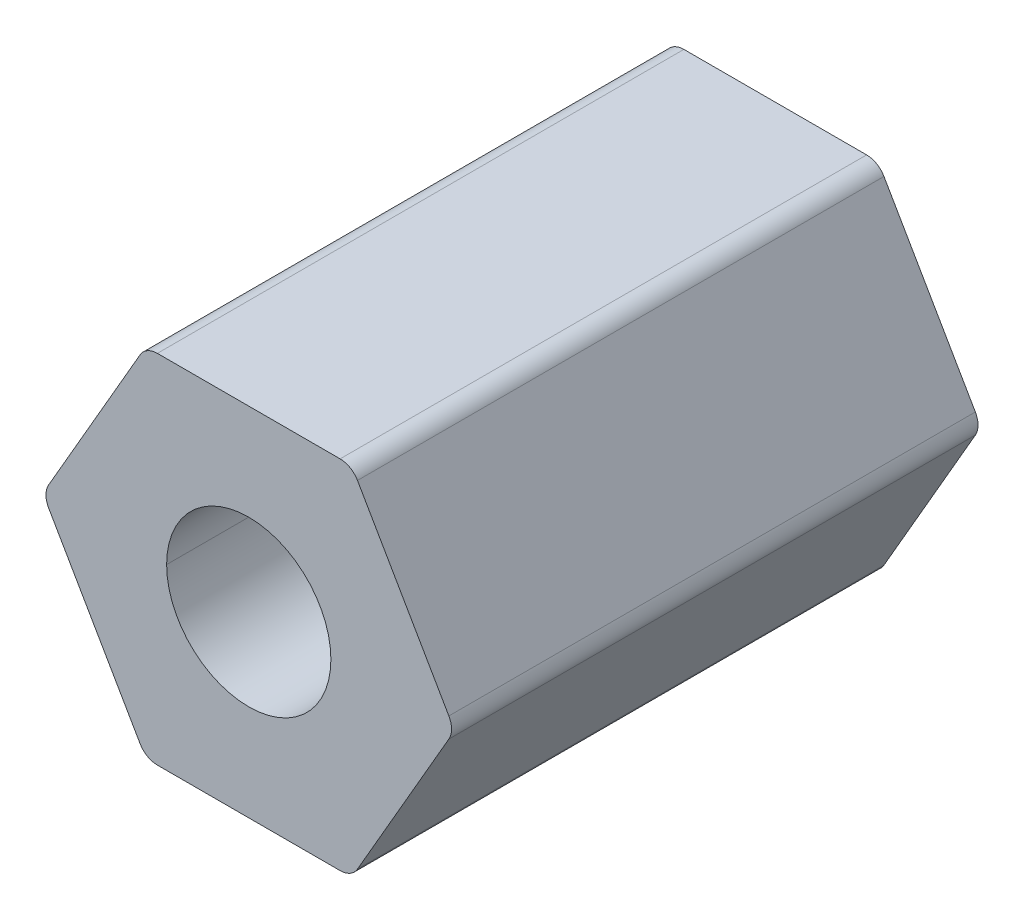
ISO-10303-21;
HEADER;
FILE_DESCRIPTION(('STEP AP214'),'2;1');
FILE_NAME('part.step','',(''),(''),'','','');
FILE_SCHEMA(('AUTOMOTIVE_DESIGN { 1 0 10303 214 1 1 1 1 }'));
ENDSEC;
DATA;
#1=APPLICATION_CONTEXT('core data for automotive mechanical design processes');
#2=APPLICATION_PROTOCOL_DEFINITION('international standard','automotive_design',2000,#1);
#3=PRODUCT_CONTEXT('',#1,'mechanical');
#4=PRODUCT('Part','Part','',(#3));
#5=PRODUCT_RELATED_PRODUCT_CATEGORY('part','',(#4));
#6=PRODUCT_DEFINITION_FORMATION('','',#4);
#7=PRODUCT_DEFINITION_CONTEXT('part definition',#1,'design');
#8=PRODUCT_DEFINITION('design','',#6,#7);
#9=PRODUCT_DEFINITION_SHAPE('','',#8);
#10=(LENGTH_UNIT() NAMED_UNIT(*) SI_UNIT(.MILLI.,.METRE.));
#11=(NAMED_UNIT(*) PLANE_ANGLE_UNIT() SI_UNIT($,.RADIAN.));
#12=(NAMED_UNIT(*) SI_UNIT($,.STERADIAN.) SOLID_ANGLE_UNIT());
#13=UNCERTAINTY_MEASURE_WITH_UNIT(LENGTH_MEASURE(1.E-05),#10,'distance_accuracy_value','');
#14=(GEOMETRIC_REPRESENTATION_CONTEXT(3) GLOBAL_UNCERTAINTY_ASSIGNED_CONTEXT((#13)) GLOBAL_UNIT_ASSIGNED_CONTEXT((#10,
#11,#12)) REPRESENTATION_CONTEXT('',''));
#15=CARTESIAN_POINT('',(0.,0.,0.));
#16=DIRECTION('',(0.,0.,1.));
#17=DIRECTION('',(1.,0.,0.));
#18=AXIS2_PLACEMENT_3D('',#15,#16,#17);
#19=CARTESIAN_POINT('',(0.,0.,-4.471676241228));
#20=DIRECTION('',(0.,0.,1.));
#21=DIRECTION('',(-1.,0.,0.));
#22=AXIS2_PLACEMENT_3D('',#19,#20,#21);
#23=CYLINDRICAL_SURFACE('',#22,1.025);
#24=DIRECTION('',(0.,0.,1.));
#25=VECTOR('',#24,1.);
#26=CARTESIAN_POINT('',(1.025,0.,0.));
#27=LINE('',#26,#25);
#28=CARTESIAN_POINT('',(1.025,0.,0.));
#29=VERTEX_POINT('',#28);
#30=CARTESIAN_POINT('',(1.025,0.,6.57));
#31=VERTEX_POINT('',#30);
#32=EDGE_CURVE('P0_E11',#29,#31,#27,.T.);
#33=ORIENTED_EDGE('',*,*,#32,.T.);
#34=CARTESIAN_POINT('',(0.,0.,6.57));
#35=DIRECTION('',(0.,0.,1.));
#36=DIRECTION('',(1.,0.,0.));
#37=AXIS2_PLACEMENT_3D('',#34,#35,#36);
#38=CIRCLE('',#37,1.025);
#39=CARTESIAN_POINT('',(-1.025,0.,6.57));
#40=VERTEX_POINT('',#39);
#41=EDGE_CURVE('P0_E184',#31,#40,#38,.T.);
#42=ORIENTED_EDGE('',*,*,#41,.T.);
#43=DIRECTION('',(0.,0.,1.));
#44=VECTOR('',#43,1.);
#45=CARTESIAN_POINT('',(-1.025,0.,0.));
#46=LINE('',#45,#44);
#47=CARTESIAN_POINT('',(-1.025,0.,0.));
#48=VERTEX_POINT('',#47);
#49=EDGE_CURVE('P0_E27',#48,#40,#46,.T.);
#50=ORIENTED_EDGE('',*,*,#49,.F.);
#51=CARTESIAN_POINT('',(0.,0.,0.));
#52=DIRECTION('',(0.,0.,1.));
#53=DIRECTION('',(1.,0.,0.));
#54=AXIS2_PLACEMENT_3D('',#51,#52,#53);
#55=CIRCLE('',#54,1.025);
#56=EDGE_CURVE('P0_E254',#29,#48,#55,.T.);
#57=ORIENTED_EDGE('',*,*,#56,.F.);
#58=EDGE_LOOP('',(#33,#42,#50,#57));
#59=FACE_BOUND('',#58,.T.);
#60=ADVANCED_FACE('P0_F17',(#59),#23,.F.);
#61=CARTESIAN_POINT('',(0.,0.,-4.471676241228));
#62=DIRECTION('',(0.,0.,1.));
#63=DIRECTION('',(-1.,0.,0.));
#64=AXIS2_PLACEMENT_3D('',#61,#62,#63);
#65=CYLINDRICAL_SURFACE('',#64,1.025);
#66=ORIENTED_EDGE('',*,*,#49,.T.);
#67=CARTESIAN_POINT('',(0.,0.,6.57));
#68=DIRECTION('',(0.,0.,1.));
#69=DIRECTION('',(-1.,0.,0.));
#70=AXIS2_PLACEMENT_3D('',#67,#68,#69);
#71=CIRCLE('',#70,1.025);
#72=EDGE_CURVE('P0_E244',#40,#31,#71,.T.);
#73=ORIENTED_EDGE('',*,*,#72,.T.);
#74=ORIENTED_EDGE('',*,*,#32,.F.);
#75=CARTESIAN_POINT('',(0.,0.,0.));
#76=DIRECTION('',(0.,0.,1.));
#77=DIRECTION('',(-1.,0.,0.));
#78=AXIS2_PLACEMENT_3D('',#75,#76,#77);
#79=CIRCLE('',#78,1.025);
#80=EDGE_CURVE('P0_E251',#48,#29,#79,.T.);
#81=ORIENTED_EDGE('',*,*,#80,.F.);
#82=EDGE_LOOP('',(#66,#73,#74,#81));
#83=FACE_BOUND('',#82,.T.);
#84=ADVANCED_FACE('P0_F317',(#83),#65,.F.);
#85=CARTESIAN_POINT('',(0.,0.,6.57));
#86=DIRECTION('',(0.,0.,1.));
#87=DIRECTION('',(1.,0.,0.));
#88=AXIS2_PLACEMENT_3D('',#85,#86,#87);
#89=PLANE('',#88);
#90=ORIENTED_EDGE('',*,*,#41,.F.);
#91=ORIENTED_EDGE('',*,*,#72,.F.);
#92=EDGE_LOOP('',(#90,#91));
#93=FACE_BOUND('',#92,.T.);
#94=DIRECTION('',(0.500000000000017,0.866025403784429,0.));
#95=VECTOR('',#94,1.);
#96=CARTESIAN_POINT('',(1.356773132596,-2.1,6.57));
#97=LINE('',#96,#95);
#98=CARTESIAN_POINT('',(1.356773132596,-2.1,6.57));
#99=VERTEX_POINT('',#98);
#100=CARTESIAN_POINT('',(2.497039914245,-0.125,6.57));
#101=VERTEX_POINT('',#100);
#102=EDGE_CURVE('P0_E182',#99,#101,#97,.T.);
#103=ORIENTED_EDGE('',*,*,#102,.T.);
#104=CARTESIAN_POINT('',(2.280533563299,0.,6.57));
#105=DIRECTION('',(0.,0.,1.));
#106=DIRECTION('',(0.866025403784429,-0.500000000000017,0.));
#107=AXIS2_PLACEMENT_3D('',#104,#105,#106);
#108=CIRCLE('',#107,0.25);
#109=CARTESIAN_POINT('',(2.497039914245,0.125,6.57));
#110=VERTEX_POINT('',#109);
#111=EDGE_CURVE('P0_E245',#101,#110,#108,.T.);
#112=ORIENTED_EDGE('',*,*,#111,.T.);
#113=DIRECTION('',(-0.500000000000017,0.866025403784429,0.));
#114=VECTOR('',#113,1.);
#115=CARTESIAN_POINT('',(2.497039914245,0.125,6.57));
#116=LINE('',#115,#114);
#117=CARTESIAN_POINT('',(1.356773132596,2.1,6.57));
#118=VERTEX_POINT('',#117);
#119=EDGE_CURVE('P0_E216',#110,#118,#116,.T.);
#120=ORIENTED_EDGE('',*,*,#119,.T.);
#121=CARTESIAN_POINT('',(1.14026678165,1.975,6.57));
#122=DIRECTION('',(0.,0.,1.));
#123=DIRECTION('',(0.866025403784429,0.500000000000017,0.));
#124=AXIS2_PLACEMENT_3D('',#121,#122,#123);
#125=CIRCLE('',#124,0.25);
#126=CARTESIAN_POINT('',(1.14026678165,2.225,6.57));
#127=VERTEX_POINT('',#126);
#128=EDGE_CURVE('P0_E201',#118,#127,#125,.T.);
#129=ORIENTED_EDGE('',*,*,#128,.T.);
#130=DIRECTION('',(-1.,0.,0.));
#131=VECTOR('',#130,1.);
#132=CARTESIAN_POINT('',(1.14026678165,2.225,6.57));
#133=LINE('',#132,#131);
#134=CARTESIAN_POINT('',(-1.14026678165,2.225,6.57));
#135=VERTEX_POINT('',#134);
#136=EDGE_CURVE('P0_E202',#127,#135,#133,.T.);
#137=ORIENTED_EDGE('',*,*,#136,.T.);
#138=CARTESIAN_POINT('',(-1.14026678165,1.975,6.57));
#139=DIRECTION('',(0.,0.,1.));
#140=DIRECTION('',(0.,1.,0.));
#141=AXIS2_PLACEMENT_3D('',#138,#139,#140);
#142=CIRCLE('',#141,0.25);
#143=CARTESIAN_POINT('',(-1.356773132596,2.1,6.57));
#144=VERTEX_POINT('',#143);
#145=EDGE_CURVE('P0_E224',#135,#144,#142,.T.);
#146=ORIENTED_EDGE('',*,*,#145,.T.);
#147=DIRECTION('',(-0.500000000000017,-0.866025403784429,0.));
#148=VECTOR('',#147,1.);
#149=CARTESIAN_POINT('',(-1.356773132596,2.1,6.57));
#150=LINE('',#149,#148);
#151=CARTESIAN_POINT('',(-2.497039914245,0.125,6.57));
#152=VERTEX_POINT('',#151);
#153=EDGE_CURVE('P0_E198',#144,#152,#150,.T.);
#154=ORIENTED_EDGE('',*,*,#153,.T.);
#155=CARTESIAN_POINT('',(-2.280533563299,0.,6.57));
#156=DIRECTION('',(0.,0.,1.));
#157=DIRECTION('',(-0.866025403784429,0.500000000000017,0.));
#158=AXIS2_PLACEMENT_3D('',#155,#156,#157);
#159=CIRCLE('',#158,0.25);
#160=CARTESIAN_POINT('',(-2.497039914245,-0.125,6.57));
#161=VERTEX_POINT('',#160);
#162=EDGE_CURVE('P0_E188',#152,#161,#159,.T.);
#163=ORIENTED_EDGE('',*,*,#162,.T.);
#164=DIRECTION('',(0.500000000000017,-0.866025403784429,0.));
#165=VECTOR('',#164,1.);
#166=CARTESIAN_POINT('',(-2.497039914245,-0.125,6.57));
#167=LINE('',#166,#165);
#168=CARTESIAN_POINT('',(-1.356773132596,-2.1,6.57));
#169=VERTEX_POINT('',#168);
#170=EDGE_CURVE('P0_E123',#161,#169,#167,.T.);
#171=ORIENTED_EDGE('',*,*,#170,.T.);
#172=CARTESIAN_POINT('',(-1.14026678165,-1.975,6.57));
#173=DIRECTION('',(0.,0.,1.));
#174=DIRECTION('',(-0.866025403784429,-0.500000000000017,0.));
#175=AXIS2_PLACEMENT_3D('',#172,#173,#174);
#176=CIRCLE('',#175,0.25);
#177=CARTESIAN_POINT('',(-1.14026678165,-2.225,6.57));
#178=VERTEX_POINT('',#177);
#179=EDGE_CURVE('P0_E131',#169,#178,#176,.T.);
#180=ORIENTED_EDGE('',*,*,#179,.T.);
#181=DIRECTION('',(1.,0.,0.));
#182=VECTOR('',#181,1.);
#183=CARTESIAN_POINT('',(-1.14026678165,-2.225,6.57));
#184=LINE('',#183,#182);
#185=CARTESIAN_POINT('',(1.14026678165,-2.225,6.57));
#186=VERTEX_POINT('',#185);
#187=EDGE_CURVE('P0_E210',#178,#186,#184,.T.);
#188=ORIENTED_EDGE('',*,*,#187,.T.);
#189=CARTESIAN_POINT('',(1.14026678165,-1.975,6.57));
#190=DIRECTION('',(0.,0.,1.));
#191=DIRECTION('',(0.,-1.,0.));
#192=AXIS2_PLACEMENT_3D('',#189,#190,#191);
#193=CIRCLE('',#192,0.25);
#194=EDGE_CURVE('P0_E204',#186,#99,#193,.T.);
#195=ORIENTED_EDGE('',*,*,#194,.T.);
#196=EDGE_LOOP('',(#103,#112,#120,#129,#137,#146,#154,#163,#171,#180,#188,#195));
#197=FACE_BOUND('',#196,.T.);
#198=ADVANCED_FACE('P0_F293',(#93,#197),#89,.T.);
#199=CARTESIAN_POINT('',(1.284604348947,-2.225,0.));
#200=DIRECTION('',(0.866025403784429,-0.500000000000017,0.));
#201=DIRECTION('',(0.,0.,-1.));
#202=AXIS2_PLACEMENT_3D('',#199,#200,#201);
#203=PLANE('',#202);
#204=DIRECTION('',(0.500000000000017,0.866025403784429,0.));
#205=VECTOR('',#204,1.);
#206=CARTESIAN_POINT('',(1.356773132596,-2.1,0.));
#207=LINE('',#206,#205);
#208=CARTESIAN_POINT('',(1.356773132596,-2.1,0.));
#209=VERTEX_POINT('',#208);
#210=CARTESIAN_POINT('',(2.497039914245,-0.125,0.));
#211=VERTEX_POINT('',#210);
#212=EDGE_CURVE('P0_E237',#209,#211,#207,.T.);
#213=ORIENTED_EDGE('',*,*,#212,.T.);
#214=DIRECTION('',(0.,0.,-1.));
#215=VECTOR('',#214,1.);
#216=CARTESIAN_POINT('',(2.497039914245,-0.125,6.57));
#217=LINE('',#216,#215);
#218=EDGE_CURVE('P0_E185',#101,#211,#217,.T.);
#219=ORIENTED_EDGE('',*,*,#218,.F.);
#220=ORIENTED_EDGE('',*,*,#102,.F.);
#221=DIRECTION('',(0.,0.,-1.));
#222=VECTOR('',#221,1.);
#223=CARTESIAN_POINT('',(1.356773132596,-2.1,6.57));
#224=LINE('',#223,#222);
#225=EDGE_CURVE('P0_E209',#99,#209,#224,.T.);
#226=ORIENTED_EDGE('',*,*,#225,.T.);
#227=EDGE_LOOP('',(#213,#219,#220,#226));
#228=FACE_BOUND('',#227,.T.);
#229=ADVANCED_FACE('P0_F354',(#228),#203,.T.);
#230=CARTESIAN_POINT('',(2.280533563299,0.,15.134652));
#231=DIRECTION('',(0.,0.,-1.));
#232=DIRECTION('',(0.866025403784429,0.500000000000017,0.));
#233=AXIS2_PLACEMENT_3D('',#230,#231,#232);
#234=CYLINDRICAL_SURFACE('',#233,0.25);
#235=DIRECTION('',(0.,0.,-1.));
#236=VECTOR('',#235,1.);
#237=CARTESIAN_POINT('',(2.497039914245,0.125,6.57));
#238=LINE('',#237,#236);
#239=CARTESIAN_POINT('',(2.497039914245,0.125,0.));
#240=VERTEX_POINT('',#239);
#241=EDGE_CURVE('P0_E219',#110,#240,#238,.T.);
#242=ORIENTED_EDGE('',*,*,#241,.F.);
#243=ORIENTED_EDGE('',*,*,#111,.F.);
#244=ORIENTED_EDGE('',*,*,#218,.T.);
#245=CARTESIAN_POINT('',(2.280533563299,0.,0.));
#246=DIRECTION('',(0.,0.,-1.));
#247=DIRECTION('',(0.866025403784429,0.500000000000017,0.));
#248=AXIS2_PLACEMENT_3D('',#245,#246,#247);
#249=CIRCLE('',#248,0.25);
#250=EDGE_CURVE('P0_E233',#240,#211,#249,.T.);
#251=ORIENTED_EDGE('',*,*,#250,.F.);
#252=EDGE_LOOP('',(#242,#243,#244,#251));
#253=FACE_BOUND('',#252,.T.);
#254=ADVANCED_FACE('P0_F351',(#253),#234,.T.);
#255=CARTESIAN_POINT('',(2.569208697894,0.,0.));
#256=DIRECTION('',(0.866025403784429,0.500000000000017,0.));
#257=DIRECTION('',(0.,0.,-1.));
#258=AXIS2_PLACEMENT_3D('',#255,#256,#257);
#259=PLANE('',#258);
#260=DIRECTION('',(-0.500000000000017,0.866025403784429,0.));
#261=VECTOR('',#260,1.);
#262=CARTESIAN_POINT('',(2.497039914245,0.125,0.));
#263=LINE('',#262,#261);
#264=CARTESIAN_POINT('',(1.356773132596,2.1,0.));
#265=VERTEX_POINT('',#264);
#266=EDGE_CURVE('P0_E229',#240,#265,#263,.T.);
#267=ORIENTED_EDGE('',*,*,#266,.T.);
#268=DIRECTION('',(0.,0.,-1.));
#269=VECTOR('',#268,1.);
#270=CARTESIAN_POINT('',(1.356773132596,2.1,6.57));
#271=LINE('',#270,#269);
#272=EDGE_CURVE('P0_E220',#118,#265,#271,.T.);
#273=ORIENTED_EDGE('',*,*,#272,.F.);
#274=ORIENTED_EDGE('',*,*,#119,.F.);
#275=ORIENTED_EDGE('',*,*,#241,.T.);
#276=EDGE_LOOP('',(#267,#273,#274,#275));
#277=FACE_BOUND('',#276,.T.);
#278=ADVANCED_FACE('P0_F19',(#277),#259,.T.);
#279=CARTESIAN_POINT('',(1.14026678165,1.975,15.134652));
#280=DIRECTION('',(0.,0.,-1.));
#281=DIRECTION('',(0.,1.,0.));
#282=AXIS2_PLACEMENT_3D('',#279,#280,#281);
#283=CYLINDRICAL_SURFACE('',#282,0.25);
#284=DIRECTION('',(0.,0.,-1.));
#285=VECTOR('',#284,1.);
#286=CARTESIAN_POINT('',(1.14026678165,2.225,6.57));
#287=LINE('',#286,#285);
#288=CARTESIAN_POINT('',(1.14026678165,2.225,0.));
#289=VERTEX_POINT('',#288);
#290=EDGE_CURVE('P0_E199',#127,#289,#287,.T.);
#291=ORIENTED_EDGE('',*,*,#290,.F.);
#292=ORIENTED_EDGE('',*,*,#128,.F.);
#293=ORIENTED_EDGE('',*,*,#272,.T.);
#294=CARTESIAN_POINT('',(1.14026678165,1.975,0.));
#295=DIRECTION('',(0.,0.,-1.));
#296=DIRECTION('',(0.,1.,0.));
#297=AXIS2_PLACEMENT_3D('',#294,#295,#296);
#298=CIRCLE('',#297,0.25);
#299=EDGE_CURVE('P0_E225',#289,#265,#298,.T.);
#300=ORIENTED_EDGE('',*,*,#299,.F.);
#301=EDGE_LOOP('',(#291,#292,#293,#300));
#302=FACE_BOUND('',#301,.T.);
#303=ADVANCED_FACE('P0_F339',(#302),#283,.T.);
#304=CARTESIAN_POINT('',(1.284604348947,2.225,0.));
#305=DIRECTION('',(0.,1.,0.));
#306=DIRECTION('',(1.,0.,0.));
#307=AXIS2_PLACEMENT_3D('',#304,#305,#306);
#308=PLANE('',#307);
#309=DIRECTION('',(-1.,0.,0.));
#310=VECTOR('',#309,1.);
#311=CARTESIAN_POINT('',(1.14026678165,2.225,0.));
#312=LINE('',#311,#310);
#313=CARTESIAN_POINT('',(-1.14026678165,2.225,0.));
#314=VERTEX_POINT('',#313);
#315=EDGE_CURVE('P0_E230',#289,#314,#312,.T.);
#316=ORIENTED_EDGE('',*,*,#315,.T.);
#317=DIRECTION('',(0.,0.,-1.));
#318=VECTOR('',#317,1.);
#319=CARTESIAN_POINT('',(-1.14026678165,2.225,6.57));
#320=LINE('',#319,#318);
#321=EDGE_CURVE('P0_E221',#135,#314,#320,.T.);
#322=ORIENTED_EDGE('',*,*,#321,.F.);
#323=ORIENTED_EDGE('',*,*,#136,.F.);
#324=ORIENTED_EDGE('',*,*,#290,.T.);
#325=EDGE_LOOP('',(#316,#322,#323,#324));
#326=FACE_BOUND('',#325,.T.);
#327=ADVANCED_FACE('P0_F301',(#326),#308,.T.);
#328=CARTESIAN_POINT('',(-1.14026678165,1.975,15.134652));
#329=DIRECTION('',(0.,0.,-1.));
#330=DIRECTION('',(-0.866025403784429,0.500000000000017,0.));
#331=AXIS2_PLACEMENT_3D('',#328,#329,#330);
#332=CYLINDRICAL_SURFACE('',#331,0.25);
#333=DIRECTION('',(0.,0.,-1.));
#334=VECTOR('',#333,1.);
#335=CARTESIAN_POINT('',(-1.356773132596,2.1,6.57));
#336=LINE('',#335,#334);
#337=CARTESIAN_POINT('',(-1.356773132596,2.1,0.));
#338=VERTEX_POINT('',#337);
#339=EDGE_CURVE('P0_E21',#144,#338,#336,.T.);
#340=ORIENTED_EDGE('',*,*,#339,.F.);
#341=ORIENTED_EDGE('',*,*,#145,.F.);
#342=ORIENTED_EDGE('',*,*,#321,.T.);
#343=CARTESIAN_POINT('',(-1.14026678165,1.975,0.));
#344=DIRECTION('',(0.,0.,-1.));
#345=DIRECTION('',(-0.866025403784429,0.500000000000017,0.));
#346=AXIS2_PLACEMENT_3D('',#343,#344,#345);
#347=CIRCLE('',#346,0.25);
#348=EDGE_CURVE('P0_E193',#338,#314,#347,.T.);
#349=ORIENTED_EDGE('',*,*,#348,.F.);
#350=EDGE_LOOP('',(#340,#341,#342,#349));
#351=FACE_BOUND('',#350,.T.);
#352=ADVANCED_FACE('P0_F305',(#351),#332,.T.);
#353=CARTESIAN_POINT('',(-1.284604348947,2.225,0.));
#354=DIRECTION('',(-0.866025403784429,0.500000000000017,0.));
#355=DIRECTION('',(0.,0.,1.));
#356=AXIS2_PLACEMENT_3D('',#353,#354,#355);
#357=PLANE('',#356);
#358=DIRECTION('',(-0.500000000000017,-0.866025403784429,0.));
#359=VECTOR('',#358,1.);
#360=CARTESIAN_POINT('',(-1.356773132596,2.1,0.));
#361=LINE('',#360,#359);
#362=CARTESIAN_POINT('',(-2.497039914245,0.125,0.));
#363=VERTEX_POINT('',#362);
#364=EDGE_CURVE('P0_E189',#338,#363,#361,.T.);
#365=ORIENTED_EDGE('',*,*,#364,.T.);
#366=DIRECTION('',(0.,0.,-1.));
#367=VECTOR('',#366,1.);
#368=CARTESIAN_POINT('',(-2.497039914245,0.125,6.57));
#369=LINE('',#368,#367);
#370=EDGE_CURVE('P0_E194',#152,#363,#369,.T.);
#371=ORIENTED_EDGE('',*,*,#370,.F.);
#372=ORIENTED_EDGE('',*,*,#153,.F.);
#373=ORIENTED_EDGE('',*,*,#339,.T.);
#374=EDGE_LOOP('',(#365,#371,#372,#373));
#375=FACE_BOUND('',#374,.T.);
#376=ADVANCED_FACE('P0_F344',(#375),#357,.T.);
#377=CARTESIAN_POINT('',(-2.280533563299,0.,15.134652));
#378=DIRECTION('',(0.,0.,-1.));
#379=DIRECTION('',(-0.866025403784429,-0.500000000000017,0.));
#380=AXIS2_PLACEMENT_3D('',#377,#378,#379);
#381=CYLINDRICAL_SURFACE('',#380,0.25);
#382=DIRECTION('',(0.,0.,-1.));
#383=VECTOR('',#382,1.);
#384=CARTESIAN_POINT('',(-2.497039914245,-0.125,6.57));
#385=LINE('',#384,#383);
#386=CARTESIAN_POINT('',(-2.497039914245,-0.125,0.));
#387=VERTEX_POINT('',#386);
#388=EDGE_CURVE('P0_E163',#161,#387,#385,.T.);
#389=ORIENTED_EDGE('',*,*,#388,.F.);
#390=ORIENTED_EDGE('',*,*,#162,.F.);
#391=ORIENTED_EDGE('',*,*,#370,.T.);
#392=CARTESIAN_POINT('',(-2.280533563299,0.,0.));
#393=DIRECTION('',(0.,0.,-1.));
#394=DIRECTION('',(-0.866025403784429,-0.500000000000017,0.));
#395=AXIS2_PLACEMENT_3D('',#392,#393,#394);
#396=CIRCLE('',#395,0.25);
#397=EDGE_CURVE('P0_E168',#387,#363,#396,.T.);
#398=ORIENTED_EDGE('',*,*,#397,.F.);
#399=EDGE_LOOP('',(#389,#390,#391,#398));
#400=FACE_BOUND('',#399,.T.);
#401=ADVANCED_FACE('P0_F432',(#400),#381,.T.);
#402=CARTESIAN_POINT('',(-2.569208697894,0.,0.));
#403=DIRECTION('',(-0.866025403784429,-0.500000000000017,0.));
#404=DIRECTION('',(-0.500000000000017,0.866025403784429,0.));
#405=AXIS2_PLACEMENT_3D('',#402,#403,#404);
#406=PLANE('',#405);
#407=DIRECTION('',(0.500000000000017,-0.866025403784429,0.));
#408=VECTOR('',#407,1.);
#409=CARTESIAN_POINT('',(-2.497039914245,-0.125,0.));
#410=LINE('',#409,#408);
#411=CARTESIAN_POINT('',(-1.356773132596,-2.1,0.));
#412=VERTEX_POINT('',#411);
#413=EDGE_CURVE('P0_E160',#387,#412,#410,.T.);
#414=ORIENTED_EDGE('',*,*,#413,.T.);
#415=DIRECTION('',(0.,0.,-1.));
#416=VECTOR('',#415,1.);
#417=CARTESIAN_POINT('',(-1.356773132596,-2.1,6.57));
#418=LINE('',#417,#416);
#419=EDGE_CURVE('P0_E150',#169,#412,#418,.T.);
#420=ORIENTED_EDGE('',*,*,#419,.F.);
#421=ORIENTED_EDGE('',*,*,#170,.F.);
#422=ORIENTED_EDGE('',*,*,#388,.T.);
#423=EDGE_LOOP('',(#414,#420,#421,#422));
#424=FACE_BOUND('',#423,.T.);
#425=ADVANCED_FACE('P0_F161',(#424),#406,.T.);
#426=CARTESIAN_POINT('',(-1.14026678165,-1.975,15.134652));
#427=DIRECTION('',(0.,0.,-1.));
#428=DIRECTION('',(0.,-1.,0.));
#429=AXIS2_PLACEMENT_3D('',#426,#427,#428);
#430=CYLINDRICAL_SURFACE('',#429,0.25);
#431=DIRECTION('',(0.,0.,-1.));
#432=VECTOR('',#431,1.);
#433=CARTESIAN_POINT('',(-1.14026678165,-2.225,6.57));
#434=LINE('',#433,#432);
#435=CARTESIAN_POINT('',(-1.14026678165,-2.225,0.));
#436=VERTEX_POINT('',#435);
#437=EDGE_CURVE('P0_E213',#178,#436,#434,.T.);
#438=ORIENTED_EDGE('',*,*,#437,.F.);
#439=ORIENTED_EDGE('',*,*,#179,.F.);
#440=ORIENTED_EDGE('',*,*,#419,.T.);
#441=CARTESIAN_POINT('',(-1.14026678165,-1.975,0.));
#442=DIRECTION('',(0.,0.,-1.));
#443=DIRECTION('',(0.,-1.,0.));
#444=AXIS2_PLACEMENT_3D('',#441,#442,#443);
#445=CIRCLE('',#444,0.25);
#446=EDGE_CURVE('P0_E154',#436,#412,#445,.T.);
#447=ORIENTED_EDGE('',*,*,#446,.F.);
#448=EDGE_LOOP('',(#438,#439,#440,#447));
#449=FACE_BOUND('',#448,.T.);
#450=ADVANCED_FACE('P0_F152',(#449),#430,.T.);
#451=CARTESIAN_POINT('',(-1.284604348947,-2.225,0.));
#452=DIRECTION('',(0.,-1.,0.));
#453=DIRECTION('',(0.,0.,-1.));
#454=AXIS2_PLACEMENT_3D('',#451,#452,#453);
#455=PLANE('',#454);
#456=ORIENTED_EDGE('',*,*,#187,.F.);
#457=ORIENTED_EDGE('',*,*,#437,.T.);
#458=DIRECTION('',(1.,0.,0.));
#459=VECTOR('',#458,1.);
#460=CARTESIAN_POINT('',(-1.14026678165,-2.225,0.));
#461=LINE('',#460,#459);
#462=CARTESIAN_POINT('',(1.14026678165,-2.225,0.));
#463=VERTEX_POINT('',#462);
#464=EDGE_CURVE('P0_E173',#436,#463,#461,.T.);
#465=ORIENTED_EDGE('',*,*,#464,.T.);
#466=DIRECTION('',(0.,0.,-1.));
#467=VECTOR('',#466,1.);
#468=CARTESIAN_POINT('',(1.14026678165,-2.225,6.57));
#469=LINE('',#468,#467);
#470=EDGE_CURVE('P0_E208',#186,#463,#469,.T.);
#471=ORIENTED_EDGE('',*,*,#470,.F.);
#472=EDGE_LOOP('',(#456,#457,#465,#471));
#473=FACE_BOUND('',#472,.T.);
#474=ADVANCED_FACE('P0_F327',(#473),#455,.T.);
#475=CARTESIAN_POINT('',(1.14026678165,-1.975,15.134652));
#476=DIRECTION('',(0.,0.,-1.));
#477=DIRECTION('',(0.866025403784429,-0.500000000000017,0.));
#478=AXIS2_PLACEMENT_3D('',#475,#476,#477);
#479=CYLINDRICAL_SURFACE('',#478,0.25);
#480=ORIENTED_EDGE('',*,*,#225,.F.);
#481=ORIENTED_EDGE('',*,*,#194,.F.);
#482=ORIENTED_EDGE('',*,*,#470,.T.);
#483=CARTESIAN_POINT('',(1.14026678165,-1.975,0.));
#484=DIRECTION('',(0.,0.,-1.));
#485=DIRECTION('',(0.866025403784429,-0.500000000000017,0.));
#486=AXIS2_PLACEMENT_3D('',#483,#484,#485);
#487=CIRCLE('',#486,0.25);
#488=EDGE_CURVE('P0_E252',#209,#463,#487,.T.);
#489=ORIENTED_EDGE('',*,*,#488,.F.);
#490=EDGE_LOOP('',(#480,#481,#482,#489));
#491=FACE_BOUND('',#490,.T.);
#492=ADVANCED_FACE('P0_F321',(#491),#479,.T.);
#493=CARTESIAN_POINT('',(0.,0.,0.));
#494=DIRECTION('',(0.,0.,1.));
#495=DIRECTION('',(1.,0.,0.));
#496=AXIS2_PLACEMENT_3D('',#493,#494,#495);
#497=PLANE('',#496);
#498=ORIENTED_EDGE('',*,*,#56,.T.);
#499=ORIENTED_EDGE('',*,*,#80,.T.);
#500=EDGE_LOOP('',(#498,#499));
#501=FACE_BOUND('',#500,.T.);
#502=ORIENTED_EDGE('',*,*,#464,.F.);
#503=ORIENTED_EDGE('',*,*,#446,.T.);
#504=ORIENTED_EDGE('',*,*,#413,.F.);
#505=ORIENTED_EDGE('',*,*,#397,.T.);
#506=ORIENTED_EDGE('',*,*,#364,.F.);
#507=ORIENTED_EDGE('',*,*,#348,.T.);
#508=ORIENTED_EDGE('',*,*,#315,.F.);
#509=ORIENTED_EDGE('',*,*,#299,.T.);
#510=ORIENTED_EDGE('',*,*,#266,.F.);
#511=ORIENTED_EDGE('',*,*,#250,.T.);
#512=ORIENTED_EDGE('',*,*,#212,.F.);
#513=ORIENTED_EDGE('',*,*,#488,.T.);
#514=EDGE_LOOP('',(#502,#503,#504,#505,#506,#507,#508,#509,#510,#511,#512,#513));
#515=FACE_BOUND('',#514,.T.);
#516=ADVANCED_FACE('P0_F170',(#501,#515),#497,.F.);
#517=CLOSED_SHELL('',(#60,#84,#198,#229,#254,#278,#303,#327,#352,#376,#401,#425,#450,#474,#492,#516));
#518=MANIFOLD_SOLID_BREP('P0_B1',#517);
#519=CARTESIAN_POINT('',(0.,0.,-4.471676241228));
#520=DIRECTION('',(0.,0.,1.));
#521=DIRECTION('',(-1.,0.,0.));
#522=AXIS2_PLACEMENT_3D('',#519,#520,#521);
#523=CYLINDRICAL_SURFACE('',#522,1.25);
#524=CARTESIAN_POINT('',(0.,0.,6.57));
#525=DIRECTION('',(0.,0.,1.));
#526=DIRECTION('',(-1.,0.,0.));
#527=AXIS2_PLACEMENT_3D('',#524,#525,#526);
#528=CIRCLE('',#527,1.25);
#529=CARTESIAN_POINT('',(1.25,0.,6.57));
#530=VERTEX_POINT('',#529);
#531=CARTESIAN_POINT('',(-1.25,0.,6.57));
#532=VERTEX_POINT('',#531);
#533=EDGE_CURVE('P1_E28',#530,#532,#528,.F.);
#534=ORIENTED_EDGE('',*,*,#533,.F.);
#535=CARTESIAN_POINT('',(1.25,0.,0.));
#536=DIRECTION('',(0.,0.,1.));
#537=VECTOR('',#536,1.);
#538=LINE('',#535,#537);
#539=CARTESIAN_POINT('',(1.25,0.,0.));
#540=VERTEX_POINT('',#539);
#541=EDGE_CURVE('P1_E57',#540,#530,#538,.T.);
#542=ORIENTED_EDGE('',*,*,#541,.F.);
#543=CARTESIAN_POINT('',(0.,0.,0.));
#544=DIRECTION('',(0.,0.,-1.));
#545=DIRECTION('',(1.,0.,0.));
#546=AXIS2_PLACEMENT_3D('',#543,#544,#545);
#547=CIRCLE('',#546,1.25);
#548=CARTESIAN_POINT('',(-1.25,0.,0.));
#549=VERTEX_POINT('',#548);
#550=EDGE_CURVE('P1_E55',#549,#540,#547,.F.);
#551=ORIENTED_EDGE('',*,*,#550,.F.);
#552=CARTESIAN_POINT('',(-1.25,0.,6.57));
#553=DIRECTION('',(0.,0.,-1.));
#554=VECTOR('',#553,1.);
#555=LINE('',#552,#554);
#556=EDGE_CURVE('P1_E11',#532,#549,#555,.T.);
#557=ORIENTED_EDGE('',*,*,#556,.F.);
#558=EDGE_LOOP('',(#534,#542,#551,#557));
#559=FACE_BOUND('',#558,.T.);
#560=ADVANCED_FACE('P1_F17',(#559),#523,.F.);
#561=CARTESIAN_POINT('',(0.,0.,-4.471676241228));
#562=DIRECTION('',(0.,0.,1.));
#563=DIRECTION('',(-1.,0.,0.));
#564=AXIS2_PLACEMENT_3D('',#561,#562,#563);
#565=CYLINDRICAL_SURFACE('',#564,1.25);
#566=CARTESIAN_POINT('',(0.,0.,6.57));
#567=DIRECTION('',(0.,0.,1.));
#568=DIRECTION('',(1.,0.,0.));
#569=AXIS2_PLACEMENT_3D('',#566,#567,#568);
#570=CIRCLE('',#569,1.25);
#571=EDGE_CURVE('P1_E35',#532,#530,#570,.F.);
#572=ORIENTED_EDGE('',*,*,#571,.F.);
#573=ORIENTED_EDGE('',*,*,#556,.T.);
#574=CARTESIAN_POINT('',(0.,0.,0.));
#575=DIRECTION('',(0.,0.,-1.));
#576=DIRECTION('',(-1.,0.,0.));
#577=AXIS2_PLACEMENT_3D('',#574,#575,#576);
#578=CIRCLE('',#577,1.25);
#579=EDGE_CURVE('P1_E42',#540,#549,#578,.F.);
#580=ORIENTED_EDGE('',*,*,#579,.F.);
#581=ORIENTED_EDGE('',*,*,#541,.T.);
#582=EDGE_LOOP('',(#572,#573,#580,#581));
#583=FACE_BOUND('',#582,.T.);
#584=ADVANCED_FACE('P1_F18',(#583),#565,.F.);
#585=OPEN_SHELL('',(#560,#584));
#586=SHELL_BASED_SURFACE_MODEL('P1_B1',(#585));
#587=ADVANCED_BREP_SHAPE_REPRESENTATION('',(#18,#518),#14);
#588=MANIFOLD_SURFACE_SHAPE_REPRESENTATION('',(#18,#586),#14);
#589=SHAPE_REPRESENTATION('',(#18),#14);
#590=SHAPE_DEFINITION_REPRESENTATION(#9,#589);
#591=SHAPE_REPRESENTATION_RELATIONSHIP('','',#589,#587);
#592=SHAPE_REPRESENTATION_RELATIONSHIP('','',#589,#588);
ENDSEC;
END-ISO-10303-21;
